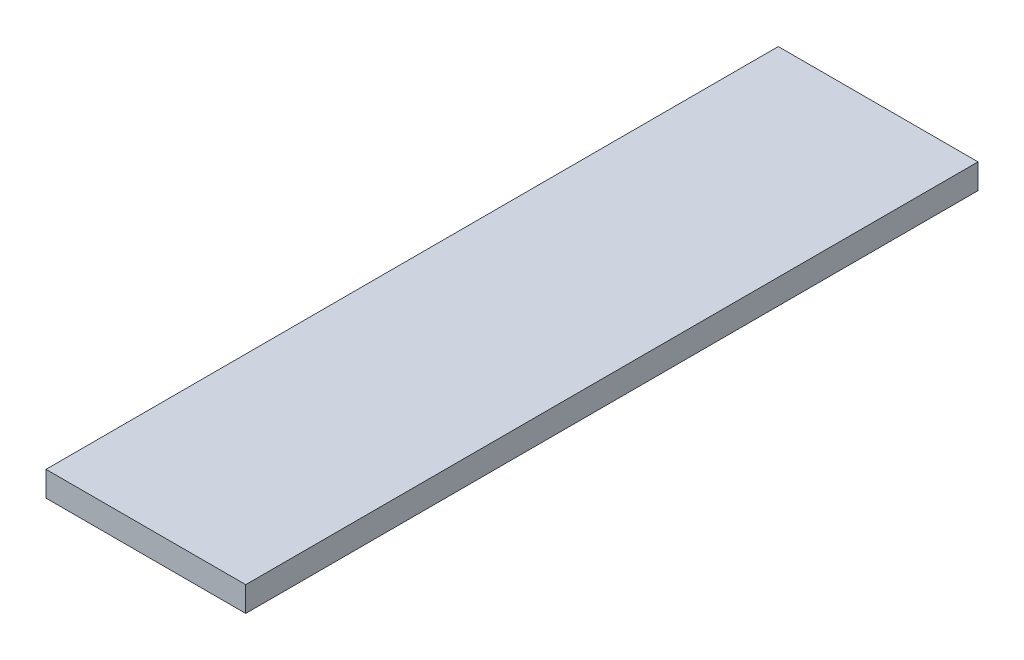
ISO-10303-21;
HEADER;
FILE_DESCRIPTION(('STEP AP214'),'2;1');
FILE_NAME('part.step','',(''),(''),'','','');
FILE_SCHEMA(('AUTOMOTIVE_DESIGN { 1 0 10303 214 1 1 1 1 }'));
ENDSEC;
DATA;
#1=APPLICATION_CONTEXT('core data for automotive mechanical design processes');
#2=APPLICATION_PROTOCOL_DEFINITION('international standard','automotive_design',2000,#1);
#3=PRODUCT_CONTEXT('',#1,'mechanical');
#4=PRODUCT('Part','Part','',(#3));
#5=PRODUCT_RELATED_PRODUCT_CATEGORY('part','',(#4));
#6=PRODUCT_DEFINITION_FORMATION('','',#4);
#7=PRODUCT_DEFINITION_CONTEXT('part definition',#1,'design');
#8=PRODUCT_DEFINITION('design','',#6,#7);
#9=PRODUCT_DEFINITION_SHAPE('','',#8);
#10=(LENGTH_UNIT() NAMED_UNIT(*) SI_UNIT(.MILLI.,.METRE.));
#11=(NAMED_UNIT(*) PLANE_ANGLE_UNIT() SI_UNIT($,.RADIAN.));
#12=(NAMED_UNIT(*) SI_UNIT($,.STERADIAN.) SOLID_ANGLE_UNIT());
#13=UNCERTAINTY_MEASURE_WITH_UNIT(LENGTH_MEASURE(1.E-05),#10,'distance_accuracy_value','');
#14=(GEOMETRIC_REPRESENTATION_CONTEXT(3) GLOBAL_UNCERTAINTY_ASSIGNED_CONTEXT((#13)) GLOBAL_UNIT_ASSIGNED_CONTEXT((#10,
#11,#12)) REPRESENTATION_CONTEXT('',''));
#15=CARTESIAN_POINT('',(0.,0.,0.));
#16=DIRECTION('',(0.,0.,1.));
#17=DIRECTION('',(1.,0.,0.));
#18=AXIS2_PLACEMENT_3D('',#15,#16,#17);
#19=CARTESIAN_POINT('',(-60.,5.,510.));
#20=DIRECTION('',(0.,0.,1.));
#21=DIRECTION('',(1.,0.,0.));
#22=AXIS2_PLACEMENT_3D('',#19,#20,#21);
#23=PLANE('',#22);
#24=DIRECTION('',(0.,1.,0.));
#25=VECTOR('',#24,1.);
#26=CARTESIAN_POINT('',(-60.,5.,510.));
#27=LINE('',#26,#25);
#28=CARTESIAN_POINT('',(-60.,5.,510.));
#29=VERTEX_POINT('',#28);
#30=CARTESIAN_POINT('',(-60.,20.,510.));
#31=VERTEX_POINT('',#30);
#32=EDGE_CURVE('E88',#29,#31,#27,.T.);
#33=ORIENTED_EDGE('',*,*,#32,.F.);
#34=DIRECTION('',(1.,0.,0.));
#35=VECTOR('',#34,1.);
#36=CARTESIAN_POINT('',(-60.,5.,510.));
#37=LINE('',#36,#35);
#38=CARTESIAN_POINT('',(60.,5.,510.));
#39=VERTEX_POINT('',#38);
#40=EDGE_CURVE('E68',#29,#39,#37,.T.);
#41=ORIENTED_EDGE('',*,*,#40,.T.);
#42=DIRECTION('',(0.,1.,0.));
#43=VECTOR('',#42,1.);
#44=CARTESIAN_POINT('',(60.,5.,510.));
#45=LINE('',#44,#43);
#46=CARTESIAN_POINT('',(60.,20.,510.));
#47=VERTEX_POINT('',#46);
#48=EDGE_CURVE('E79',#39,#47,#45,.T.);
#49=ORIENTED_EDGE('',*,*,#48,.T.);
#50=DIRECTION('',(1.,0.,0.));
#51=VECTOR('',#50,1.);
#52=CARTESIAN_POINT('',(-60.,20.,510.));
#53=LINE('',#52,#51);
#54=EDGE_CURVE('E9',#31,#47,#53,.T.);
#55=ORIENTED_EDGE('',*,*,#54,.F.);
#56=EDGE_LOOP('',(#33,#41,#49,#55));
#57=FACE_BOUND('',#56,.T.);
#58=ADVANCED_FACE('F15',(#57),#23,.T.);
#59=CARTESIAN_POINT('',(-60.,5.,70.));
#60=DIRECTION('',(0.,0.,1.));
#61=DIRECTION('',(1.,0.,0.));
#62=AXIS2_PLACEMENT_3D('',#59,#60,#61);
#63=PLANE('',#62);
#64=DIRECTION('',(1.,0.,0.));
#65=VECTOR('',#64,1.);
#66=CARTESIAN_POINT('',(-60.,20.,70.));
#67=LINE('',#66,#65);
#68=CARTESIAN_POINT('',(-60.,20.,70.));
#69=VERTEX_POINT('',#68);
#70=CARTESIAN_POINT('',(60.,20.,70.));
#71=VERTEX_POINT('',#70);
#72=EDGE_CURVE('E23',#69,#71,#67,.T.);
#73=ORIENTED_EDGE('',*,*,#72,.T.);
#74=DIRECTION('',(0.,1.,0.));
#75=VECTOR('',#74,1.);
#76=CARTESIAN_POINT('',(60.,5.,70.));
#77=LINE('',#76,#75);
#78=CARTESIAN_POINT('',(60.,5.,70.));
#79=VERTEX_POINT('',#78);
#80=EDGE_CURVE('E102',#79,#71,#77,.T.);
#81=ORIENTED_EDGE('',*,*,#80,.F.);
#82=DIRECTION('',(1.,0.,0.));
#83=VECTOR('',#82,1.);
#84=CARTESIAN_POINT('',(-60.,5.,70.));
#85=LINE('',#84,#83);
#86=CARTESIAN_POINT('',(-60.,5.,70.));
#87=VERTEX_POINT('',#86);
#88=EDGE_CURVE('E78',#87,#79,#85,.T.);
#89=ORIENTED_EDGE('',*,*,#88,.F.);
#90=DIRECTION('',(0.,1.,0.));
#91=VECTOR('',#90,1.);
#92=CARTESIAN_POINT('',(-60.,5.,70.));
#93=LINE('',#92,#91);
#94=EDGE_CURVE('E87',#87,#69,#93,.T.);
#95=ORIENTED_EDGE('',*,*,#94,.T.);
#96=EDGE_LOOP('',(#73,#81,#89,#95));
#97=FACE_BOUND('',#96,.T.);
#98=ADVANCED_FACE('F111',(#97),#63,.F.);
#99=CARTESIAN_POINT('',(-60.,20.,70.));
#100=DIRECTION('',(0.,1.,0.));
#101=DIRECTION('',(1.,0.,0.));
#102=AXIS2_PLACEMENT_3D('',#99,#100,#101);
#103=PLANE('',#102);
#104=ORIENTED_EDGE('',*,*,#72,.F.);
#105=DIRECTION('',(0.,0.,1.));
#106=VECTOR('',#105,1.);
#107=CARTESIAN_POINT('',(-60.,20.,70.));
#108=LINE('',#107,#106);
#109=EDGE_CURVE('E93',#69,#31,#108,.T.);
#110=ORIENTED_EDGE('',*,*,#109,.T.);
#111=ORIENTED_EDGE('',*,*,#54,.T.);
#112=DIRECTION('',(0.,0.,1.));
#113=VECTOR('',#112,1.);
#114=CARTESIAN_POINT('',(60.,20.,70.));
#115=LINE('',#114,#113);
#116=EDGE_CURVE('E97',#71,#47,#115,.T.);
#117=ORIENTED_EDGE('',*,*,#116,.F.);
#118=EDGE_LOOP('',(#104,#110,#111,#117));
#119=FACE_BOUND('',#118,.T.);
#120=ADVANCED_FACE('F117',(#119),#103,.T.);
#121=CARTESIAN_POINT('',(-60.,5.,70.));
#122=DIRECTION('',(0.,1.,0.));
#123=DIRECTION('',(1.,0.,0.));
#124=AXIS2_PLACEMENT_3D('',#121,#122,#123);
#125=PLANE('',#124);
#126=DIRECTION('',(0.,0.,1.));
#127=VECTOR('',#126,1.);
#128=CARTESIAN_POINT('',(60.,5.,70.));
#129=LINE('',#128,#127);
#130=EDGE_CURVE('E72',#79,#39,#129,.T.);
#131=ORIENTED_EDGE('',*,*,#130,.T.);
#132=ORIENTED_EDGE('',*,*,#40,.F.);
#133=DIRECTION('',(0.,0.,1.));
#134=VECTOR('',#133,1.);
#135=CARTESIAN_POINT('',(-60.,5.,70.));
#136=LINE('',#135,#134);
#137=EDGE_CURVE('E75',#87,#29,#136,.T.);
#138=ORIENTED_EDGE('',*,*,#137,.F.);
#139=ORIENTED_EDGE('',*,*,#88,.T.);
#140=EDGE_LOOP('',(#131,#132,#138,#139));
#141=FACE_BOUND('',#140,.T.);
#142=ADVANCED_FACE('F69',(#141),#125,.F.);
#143=CARTESIAN_POINT('',(60.,5.,70.));
#144=DIRECTION('',(1.,0.,0.));
#145=DIRECTION('',(0.,1.,0.));
#146=AXIS2_PLACEMENT_3D('',#143,#144,#145);
#147=PLANE('',#146);
#148=ORIENTED_EDGE('',*,*,#130,.F.);
#149=ORIENTED_EDGE('',*,*,#80,.T.);
#150=ORIENTED_EDGE('',*,*,#116,.T.);
#151=ORIENTED_EDGE('',*,*,#48,.F.);
#152=EDGE_LOOP('',(#148,#149,#150,#151));
#153=FACE_BOUND('',#152,.T.);
#154=ADVANCED_FACE('F116',(#153),#147,.T.);
#155=CARTESIAN_POINT('',(-60.,5.,70.));
#156=DIRECTION('',(1.,0.,0.));
#157=DIRECTION('',(0.,1.,0.));
#158=AXIS2_PLACEMENT_3D('',#155,#156,#157);
#159=PLANE('',#158);
#160=ORIENTED_EDGE('',*,*,#32,.T.);
#161=ORIENTED_EDGE('',*,*,#109,.F.);
#162=ORIENTED_EDGE('',*,*,#94,.F.);
#163=ORIENTED_EDGE('',*,*,#137,.T.);
#164=EDGE_LOOP('',(#160,#161,#162,#163));
#165=FACE_BOUND('',#164,.T.);
#166=ADVANCED_FACE('F82',(#165),#159,.F.);
#167=CLOSED_SHELL('',(#58,#98,#120,#142,#154,#166));
#168=MANIFOLD_SOLID_BREP('B1',#167);
#169=ADVANCED_BREP_SHAPE_REPRESENTATION('',(#18,#168),#14);
#170=SHAPE_DEFINITION_REPRESENTATION(#9,#169);
ENDSEC;
END-ISO-10303-21;
